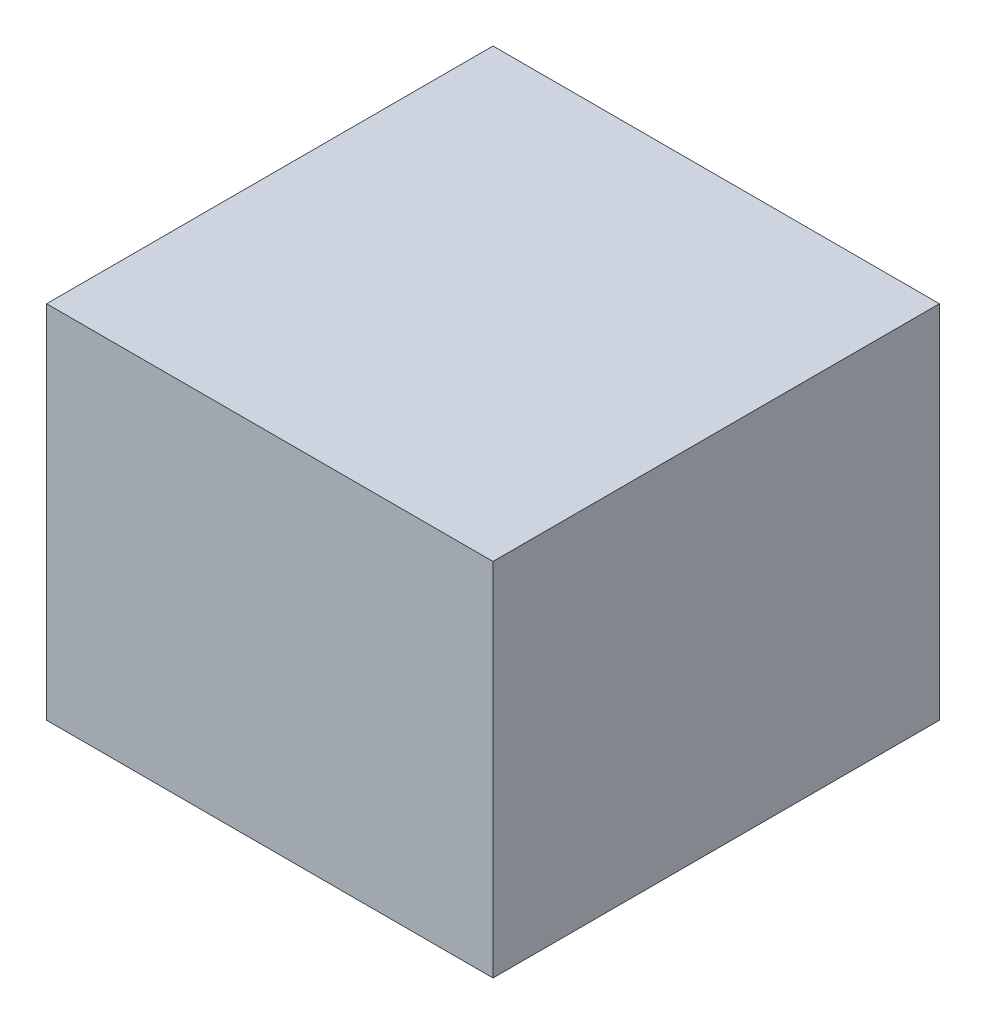
ISO-10303-21;
HEADER;
FILE_DESCRIPTION(('STEP AP214'),'2;1');
FILE_NAME('part.step','',(''),(''),'','','');
FILE_SCHEMA(('AUTOMOTIVE_DESIGN { 1 0 10303 214 1 1 1 1 }'));
ENDSEC;
DATA;
#1=APPLICATION_CONTEXT('core data for automotive mechanical design processes');
#2=APPLICATION_PROTOCOL_DEFINITION('international standard','automotive_design',2000,#1);
#3=PRODUCT_CONTEXT('',#1,'mechanical');
#4=PRODUCT('Part','Part','',(#3));
#5=PRODUCT_RELATED_PRODUCT_CATEGORY('part','',(#4));
#6=PRODUCT_DEFINITION_FORMATION('','',#4);
#7=PRODUCT_DEFINITION_CONTEXT('part definition',#1,'design');
#8=PRODUCT_DEFINITION('design','',#6,#7);
#9=PRODUCT_DEFINITION_SHAPE('','',#8);
#10=(LENGTH_UNIT() NAMED_UNIT(*) SI_UNIT(.MILLI.,.METRE.));
#11=(NAMED_UNIT(*) PLANE_ANGLE_UNIT() SI_UNIT($,.RADIAN.));
#12=(NAMED_UNIT(*) SI_UNIT($,.STERADIAN.) SOLID_ANGLE_UNIT());
#13=UNCERTAINTY_MEASURE_WITH_UNIT(LENGTH_MEASURE(1.E-05),#10,'distance_accuracy_value','');
#14=(GEOMETRIC_REPRESENTATION_CONTEXT(3) GLOBAL_UNCERTAINTY_ASSIGNED_CONTEXT((#13)) GLOBAL_UNIT_ASSIGNED_CONTEXT((#10,
#11,#12)) REPRESENTATION_CONTEXT('',''));
#15=CARTESIAN_POINT('',(0.,0.,0.));
#16=DIRECTION('',(0.,0.,1.));
#17=DIRECTION('',(1.,0.,0.));
#18=AXIS2_PLACEMENT_3D('',#15,#16,#17);
#19=CARTESIAN_POINT('',(24.75,40.,24.75));
#20=DIRECTION('',(-1.,0.,0.));
#21=DIRECTION('',(0.,0.,1.));
#22=AXIS2_PLACEMENT_3D('',#19,#20,#21);
#23=PLANE('',#22);
#24=DIRECTION('',(0.,0.,-1.));
#25=VECTOR('',#24,1.);
#26=CARTESIAN_POINT('',(24.75,0.,24.75));
#27=LINE('',#26,#25);
#28=CARTESIAN_POINT('',(24.75,0.,24.75));
#29=VERTEX_POINT('',#28);
#30=CARTESIAN_POINT('',(24.75,0.,-24.75));
#31=VERTEX_POINT('',#30);
#32=EDGE_CURVE('E99',#29,#31,#27,.T.);
#33=ORIENTED_EDGE('',*,*,#32,.T.);
#34=DIRECTION('',(0.,-1.,0.));
#35=VECTOR('',#34,1.);
#36=CARTESIAN_POINT('',(24.75,40.,-24.75));
#37=LINE('',#36,#35);
#38=CARTESIAN_POINT('',(24.75,40.,-24.75));
#39=VERTEX_POINT('',#38);
#40=EDGE_CURVE('E11',#39,#31,#37,.T.);
#41=ORIENTED_EDGE('',*,*,#40,.F.);
#42=DIRECTION('',(0.,0.,-1.));
#43=VECTOR('',#42,1.);
#44=CARTESIAN_POINT('',(24.75,40.,24.75));
#45=LINE('',#44,#43);
#46=CARTESIAN_POINT('',(24.75,40.,24.75));
#47=VERTEX_POINT('',#46);
#48=EDGE_CURVE('E87',#47,#39,#45,.T.);
#49=ORIENTED_EDGE('',*,*,#48,.F.);
#50=DIRECTION('',(0.,-1.,0.));
#51=VECTOR('',#50,1.);
#52=CARTESIAN_POINT('',(24.75,40.,24.75));
#53=LINE('',#52,#51);
#54=EDGE_CURVE('E95',#47,#29,#53,.T.);
#55=ORIENTED_EDGE('',*,*,#54,.T.);
#56=EDGE_LOOP('',(#33,#41,#49,#55));
#57=FACE_BOUND('',#56,.T.);
#58=ADVANCED_FACE('F36',(#57),#23,.F.);
#59=CARTESIAN_POINT('',(-24.75,40.,-24.75));
#60=DIRECTION('',(0.,0.,1.));
#61=DIRECTION('',(1.,0.,0.));
#62=AXIS2_PLACEMENT_3D('',#59,#60,#61);
#63=PLANE('',#62);
#64=DIRECTION('',(-1.,0.,0.));
#65=VECTOR('',#64,1.);
#66=CARTESIAN_POINT('',(-24.75,0.,-24.75));
#67=LINE('',#66,#65);
#68=CARTESIAN_POINT('',(-24.75,0.,-24.75));
#69=VERTEX_POINT('',#68);
#70=EDGE_CURVE('E91',#31,#69,#67,.T.);
#71=ORIENTED_EDGE('',*,*,#70,.T.);
#72=DIRECTION('',(0.,-1.,0.));
#73=VECTOR('',#72,1.);
#74=CARTESIAN_POINT('',(-24.75,40.,-24.75));
#75=LINE('',#74,#73);
#76=CARTESIAN_POINT('',(-24.75,40.,-24.75));
#77=VERTEX_POINT('',#76);
#78=EDGE_CURVE('E44',#77,#69,#75,.T.);
#79=ORIENTED_EDGE('',*,*,#78,.F.);
#80=DIRECTION('',(-1.,0.,0.));
#81=VECTOR('',#80,1.);
#82=CARTESIAN_POINT('',(-24.75,40.,-24.75));
#83=LINE('',#82,#81);
#84=EDGE_CURVE('E82',#39,#77,#83,.T.);
#85=ORIENTED_EDGE('',*,*,#84,.F.);
#86=ORIENTED_EDGE('',*,*,#40,.T.);
#87=EDGE_LOOP('',(#71,#79,#85,#86));
#88=FACE_BOUND('',#87,.T.);
#89=ADVANCED_FACE('F90',(#88),#63,.F.);
#90=CARTESIAN_POINT('',(-24.75,40.,24.75));
#91=DIRECTION('',(1.,0.,0.));
#92=DIRECTION('',(0.,0.,-1.));
#93=AXIS2_PLACEMENT_3D('',#90,#91,#92);
#94=PLANE('',#93);
#95=DIRECTION('',(0.,0.,1.));
#96=VECTOR('',#95,1.);
#97=CARTESIAN_POINT('',(-24.75,0.,24.75));
#98=LINE('',#97,#96);
#99=CARTESIAN_POINT('',(-24.75,0.,24.75));
#100=VERTEX_POINT('',#99);
#101=EDGE_CURVE('E69',#69,#100,#98,.T.);
#102=ORIENTED_EDGE('',*,*,#101,.T.);
#103=DIRECTION('',(0.,-1.,0.));
#104=VECTOR('',#103,1.);
#105=CARTESIAN_POINT('',(-24.75,40.,24.75));
#106=LINE('',#105,#104);
#107=CARTESIAN_POINT('',(-24.75,40.,24.75));
#108=VERTEX_POINT('',#107);
#109=EDGE_CURVE('E92',#108,#100,#106,.T.);
#110=ORIENTED_EDGE('',*,*,#109,.F.);
#111=DIRECTION('',(0.,0.,1.));
#112=VECTOR('',#111,1.);
#113=CARTESIAN_POINT('',(-24.75,40.,24.75));
#114=LINE('',#113,#112);
#115=EDGE_CURVE('E85',#77,#108,#114,.T.);
#116=ORIENTED_EDGE('',*,*,#115,.F.);
#117=ORIENTED_EDGE('',*,*,#78,.T.);
#118=EDGE_LOOP('',(#102,#110,#116,#117));
#119=FACE_BOUND('',#118,.T.);
#120=ADVANCED_FACE('F93',(#119),#94,.F.);
#121=CARTESIAN_POINT('',(-24.75,40.,24.75));
#122=DIRECTION('',(0.,0.,-1.));
#123=DIRECTION('',(-1.,0.,0.));
#124=AXIS2_PLACEMENT_3D('',#121,#122,#123);
#125=PLANE('',#124);
#126=DIRECTION('',(1.,0.,0.));
#127=VECTOR('',#126,1.);
#128=CARTESIAN_POINT('',(-24.75,0.,24.75));
#129=LINE('',#128,#127);
#130=EDGE_CURVE('E75',#100,#29,#129,.T.);
#131=ORIENTED_EDGE('',*,*,#130,.T.);
#132=ORIENTED_EDGE('',*,*,#54,.F.);
#133=DIRECTION('',(1.,0.,0.));
#134=VECTOR('',#133,1.);
#135=CARTESIAN_POINT('',(-24.75,40.,24.75));
#136=LINE('',#135,#134);
#137=EDGE_CURVE('E52',#108,#47,#136,.T.);
#138=ORIENTED_EDGE('',*,*,#137,.F.);
#139=ORIENTED_EDGE('',*,*,#109,.T.);
#140=EDGE_LOOP('',(#131,#132,#138,#139));
#141=FACE_BOUND('',#140,.T.);
#142=ADVANCED_FACE('F106',(#141),#125,.F.);
#143=CARTESIAN_POINT('',(0.,40.,0.));
#144=DIRECTION('',(0.,-1.,0.));
#145=DIRECTION('',(0.,0.,-1.));
#146=AXIS2_PLACEMENT_3D('',#143,#144,#145);
#147=PLANE('',#146);
#148=ORIENTED_EDGE('',*,*,#48,.T.);
#149=ORIENTED_EDGE('',*,*,#84,.T.);
#150=ORIENTED_EDGE('',*,*,#115,.T.);
#151=ORIENTED_EDGE('',*,*,#137,.T.);
#152=EDGE_LOOP('',(#148,#149,#150,#151));
#153=FACE_BOUND('',#152,.T.);
#154=ADVANCED_FACE('F83',(#153),#147,.F.);
#155=CARTESIAN_POINT('',(0.,0.,0.));
#156=DIRECTION('',(0.,-1.,0.));
#157=DIRECTION('',(0.,0.,-1.));
#158=AXIS2_PLACEMENT_3D('',#155,#156,#157);
#159=PLANE('',#158);
#160=ORIENTED_EDGE('',*,*,#32,.F.);
#161=ORIENTED_EDGE('',*,*,#130,.F.);
#162=ORIENTED_EDGE('',*,*,#101,.F.);
#163=ORIENTED_EDGE('',*,*,#70,.F.);
#164=EDGE_LOOP('',(#160,#161,#162,#163));
#165=FACE_BOUND('',#164,.T.);
#166=ADVANCED_FACE('F109',(#165),#159,.T.);
#167=CLOSED_SHELL('',(#58,#89,#120,#142,#154,#166));
#168=MANIFOLD_SOLID_BREP('B2',#167);
#169=ADVANCED_BREP_SHAPE_REPRESENTATION('',(#18,#168),#14);
#170=SHAPE_DEFINITION_REPRESENTATION(#9,#169);
ENDSEC;
END-ISO-10303-21;
